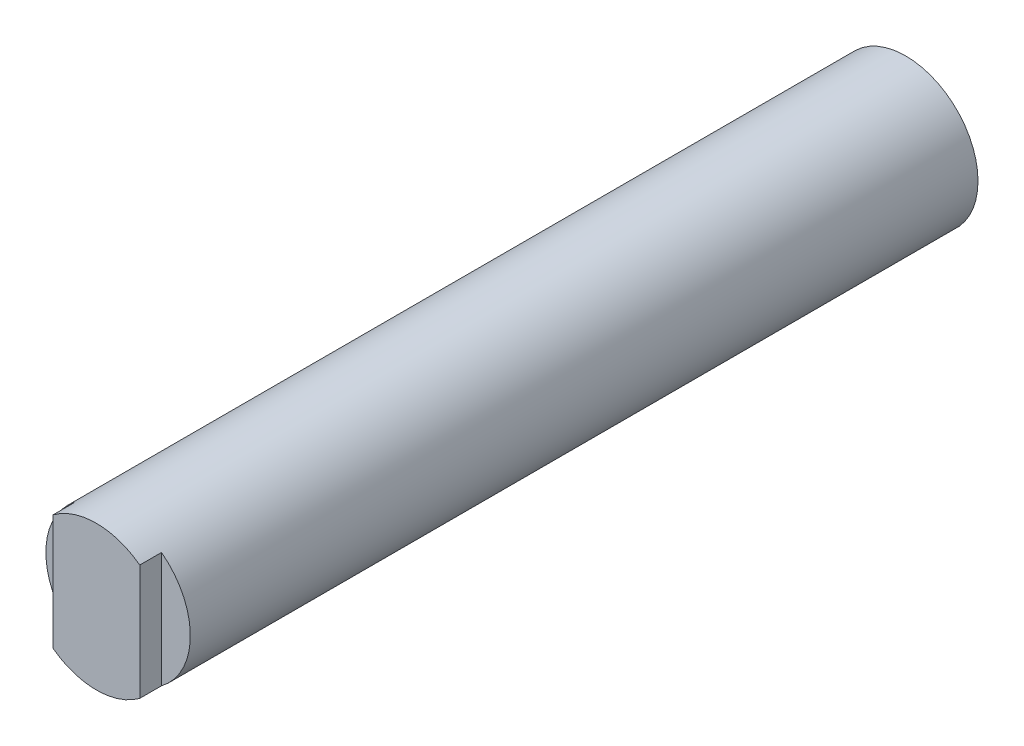
ISO-10303-21;
HEADER;
FILE_DESCRIPTION(('STEP AP214'),'2;1');
FILE_NAME('part.step','',(''),(''),'','','');
FILE_SCHEMA(('AUTOMOTIVE_DESIGN { 1 0 10303 214 1 1 1 1 }'));
ENDSEC;
DATA;
#1=APPLICATION_CONTEXT('core data for automotive mechanical design processes');
#2=APPLICATION_PROTOCOL_DEFINITION('international standard','automotive_design',2000,#1);
#3=PRODUCT_CONTEXT('',#1,'mechanical');
#4=PRODUCT('Part','Part','',(#3));
#5=PRODUCT_RELATED_PRODUCT_CATEGORY('part','',(#4));
#6=PRODUCT_DEFINITION_FORMATION('','',#4);
#7=PRODUCT_DEFINITION_CONTEXT('part definition',#1,'design');
#8=PRODUCT_DEFINITION('design','',#6,#7);
#9=PRODUCT_DEFINITION_SHAPE('','',#8);
#10=(LENGTH_UNIT() NAMED_UNIT(*) SI_UNIT(.MILLI.,.METRE.));
#11=(NAMED_UNIT(*) PLANE_ANGLE_UNIT() SI_UNIT($,.RADIAN.));
#12=(NAMED_UNIT(*) SI_UNIT($,.STERADIAN.) SOLID_ANGLE_UNIT());
#13=UNCERTAINTY_MEASURE_WITH_UNIT(LENGTH_MEASURE(1.E-05),#10,'distance_accuracy_value','');
#14=(GEOMETRIC_REPRESENTATION_CONTEXT(3) GLOBAL_UNCERTAINTY_ASSIGNED_CONTEXT((#13)) GLOBAL_UNIT_ASSIGNED_CONTEXT((#10,
#11,#12)) REPRESENTATION_CONTEXT('',''));
#15=CARTESIAN_POINT('',(0.,0.,0.));
#16=DIRECTION('',(0.,0.,1.));
#17=DIRECTION('',(1.,0.,0.));
#18=AXIS2_PLACEMENT_3D('',#15,#16,#17);
#19=CARTESIAN_POINT('',(0.,0.,295.275));
#20=DIRECTION('',(0.,0.,-1.));
#21=DIRECTION('',(-1.,0.,0.));
#22=AXIS2_PLACEMENT_3D('',#19,#20,#21);
#23=CYLINDRICAL_SURFACE('',#22,26.3525);
#24=CARTESIAN_POINT('',(0.,0.,295.275));
#25=DIRECTION('',(0.,0.,1.));
#26=DIRECTION('',(1.,0.,0.));
#27=AXIS2_PLACEMENT_3D('',#24,#25,#26);
#28=CIRCLE('',#27,26.3525);
#29=CARTESIAN_POINT('',(15.8369,21.0629260702306,295.275));
#30=VERTEX_POINT('',#29);
#31=CARTESIAN_POINT('',(-15.8369,21.0629260702306,295.275));
#32=VERTEX_POINT('',#31);
#33=EDGE_CURVE('E40',#30,#32,#28,.T.);
#34=ORIENTED_EDGE('',*,*,#33,.F.);
#35=DIRECTION('',(0.,0.,1.));
#36=VECTOR('',#35,1.);
#37=CARTESIAN_POINT('',(15.8369,21.0629260702306,287.3375));
#38=LINE('',#37,#36);
#39=CARTESIAN_POINT('',(15.8369,21.0629260702306,287.3375));
#40=VERTEX_POINT('',#39);
#41=EDGE_CURVE('E47',#40,#30,#38,.T.);
#42=ORIENTED_EDGE('',*,*,#41,.F.);
#43=CARTESIAN_POINT('',(0.,0.,287.3375));
#44=DIRECTION('',(0.,0.,1.));
#45=DIRECTION('',(1.,0.,0.));
#46=AXIS2_PLACEMENT_3D('',#43,#44,#45);
#47=CIRCLE('',#46,26.3525);
#48=CARTESIAN_POINT('',(15.8369,-21.0629260702306,287.3375));
#49=VERTEX_POINT('',#48);
#50=EDGE_CURVE('E76',#49,#40,#47,.T.);
#51=ORIENTED_EDGE('',*,*,#50,.F.);
#52=DIRECTION('',(0.,0.,1.));
#53=VECTOR('',#52,1.);
#54=CARTESIAN_POINT('',(15.8369,-21.0629260702306,287.3375));
#55=LINE('',#54,#53);
#56=CARTESIAN_POINT('',(15.8369,-21.0629260702306,295.275));
#57=VERTEX_POINT('',#56);
#58=EDGE_CURVE('E84',#49,#57,#55,.T.);
#59=ORIENTED_EDGE('',*,*,#58,.T.);
#60=CARTESIAN_POINT('',(-15.8369,-21.0629260702306,295.275));
#61=VERTEX_POINT('',#60);
#62=EDGE_CURVE('E11',#61,#57,#28,.T.);
#63=ORIENTED_EDGE('',*,*,#62,.F.);
#64=DIRECTION('',(0.,0.,1.));
#65=VECTOR('',#64,1.);
#66=CARTESIAN_POINT('',(-15.8369,-21.0629260702306,287.3375));
#67=LINE('',#66,#65);
#68=CARTESIAN_POINT('',(-15.8369,-21.0629260702306,287.3375));
#69=VERTEX_POINT('',#68);
#70=EDGE_CURVE('E55',#69,#61,#67,.T.);
#71=ORIENTED_EDGE('',*,*,#70,.F.);
#72=CARTESIAN_POINT('',(0.,0.,287.3375));
#73=DIRECTION('',(0.,0.,1.));
#74=DIRECTION('',(1.,0.,0.));
#75=AXIS2_PLACEMENT_3D('',#72,#73,#74);
#76=CIRCLE('',#75,26.3525);
#77=CARTESIAN_POINT('',(-15.8369,21.0629260702306,287.3375));
#78=VERTEX_POINT('',#77);
#79=EDGE_CURVE('E94',#78,#69,#76,.T.);
#80=ORIENTED_EDGE('',*,*,#79,.F.);
#81=DIRECTION('',(0.,0.,1.));
#82=VECTOR('',#81,1.);
#83=CARTESIAN_POINT('',(-15.8369,21.0629260702306,287.3375));
#84=LINE('',#83,#82);
#85=EDGE_CURVE('E100',#78,#32,#84,.T.);
#86=ORIENTED_EDGE('',*,*,#85,.T.);
#87=EDGE_LOOP('',(#34,#42,#51,#59,#63,#71,#80,#86));
#88=FACE_BOUND('',#87,.T.);
#89=CARTESIAN_POINT('',(0.,0.,0.));
#90=DIRECTION('',(0.,0.,1.));
#91=DIRECTION('',(1.,0.,0.));
#92=AXIS2_PLACEMENT_3D('',#89,#90,#91);
#93=CIRCLE('',#92,26.3525);
#94=CARTESIAN_POINT('',(26.3525,0.,0.));
#95=VERTEX_POINT('',#94);
#96=EDGE_CURVE('E35',#95,#95,#93,.T.);
#97=ORIENTED_EDGE('',*,*,#96,.T.);
#98=EDGE_LOOP('',(#97));
#99=FACE_BOUND('',#98,.T.);
#100=ADVANCED_FACE('F32',(#88,#99),#23,.T.);
#101=CARTESIAN_POINT('',(0.,0.,295.275));
#102=DIRECTION('',(0.,0.,1.));
#103=DIRECTION('',(1.,0.,0.));
#104=AXIS2_PLACEMENT_3D('',#101,#102,#103);
#105=PLANE('',#104);
#106=DIRECTION('',(0.,-1.,0.));
#107=VECTOR('',#106,1.);
#108=CARTESIAN_POINT('',(15.8369,-21.0629260702306,295.275));
#109=LINE('',#108,#107);
#110=EDGE_CURVE('E81',#30,#57,#109,.T.);
#111=ORIENTED_EDGE('',*,*,#110,.F.);
#112=ORIENTED_EDGE('',*,*,#33,.T.);
#113=DIRECTION('',(0.,1.,0.));
#114=VECTOR('',#113,1.);
#115=CARTESIAN_POINT('',(-15.8369,21.0629260702306,295.275));
#116=LINE('',#115,#114);
#117=EDGE_CURVE('E90',#61,#32,#116,.T.);
#118=ORIENTED_EDGE('',*,*,#117,.F.);
#119=ORIENTED_EDGE('',*,*,#62,.T.);
#120=EDGE_LOOP('',(#111,#112,#118,#119));
#121=FACE_BOUND('',#120,.T.);
#122=ADVANCED_FACE('F106',(#121),#105,.T.);
#123=CARTESIAN_POINT('',(0.,0.,0.));
#124=DIRECTION('',(0.,0.,1.));
#125=DIRECTION('',(1.,0.,0.));
#126=AXIS2_PLACEMENT_3D('',#123,#124,#125);
#127=PLANE('',#126);
#128=ORIENTED_EDGE('',*,*,#96,.F.);
#129=EDGE_LOOP('',(#128));
#130=FACE_BOUND('',#129,.T.);
#131=ADVANCED_FACE('F118',(#130),#127,.F.);
#132=CARTESIAN_POINT('',(-15.8369,21.0629260702306,287.3375));
#133=DIRECTION('',(1.,0.,0.));
#134=DIRECTION('',(0.,0.,-1.));
#135=AXIS2_PLACEMENT_3D('',#132,#133,#134);
#136=PLANE('',#135);
#137=ORIENTED_EDGE('',*,*,#117,.T.);
#138=ORIENTED_EDGE('',*,*,#85,.F.);
#139=DIRECTION('',(0.,1.,0.));
#140=VECTOR('',#139,1.);
#141=CARTESIAN_POINT('',(-15.8369,21.0629260702306,287.3375));
#142=LINE('',#141,#140);
#143=EDGE_CURVE('E96',#69,#78,#142,.T.);
#144=ORIENTED_EDGE('',*,*,#143,.F.);
#145=ORIENTED_EDGE('',*,*,#70,.T.);
#146=EDGE_LOOP('',(#137,#138,#144,#145));
#147=FACE_BOUND('',#146,.T.);
#148=ADVANCED_FACE('F108',(#147),#136,.F.);
#149=CARTESIAN_POINT('',(0.,0.,287.3375));
#150=DIRECTION('',(0.,0.,1.));
#151=DIRECTION('',(1.,0.,0.));
#152=AXIS2_PLACEMENT_3D('',#149,#150,#151);
#153=PLANE('',#152);
#154=ORIENTED_EDGE('',*,*,#79,.T.);
#155=ORIENTED_EDGE('',*,*,#143,.T.);
#156=EDGE_LOOP('',(#154,#155));
#157=FACE_BOUND('',#156,.T.);
#158=ADVANCED_FACE('F110',(#157),#153,.T.);
#159=CARTESIAN_POINT('',(15.8369,-21.0629260702306,287.3375));
#160=DIRECTION('',(-1.,0.,0.));
#161=DIRECTION('',(0.,0.,1.));
#162=AXIS2_PLACEMENT_3D('',#159,#160,#161);
#163=PLANE('',#162);
#164=ORIENTED_EDGE('',*,*,#110,.T.);
#165=ORIENTED_EDGE('',*,*,#58,.F.);
#166=DIRECTION('',(0.,-1.,0.));
#167=VECTOR('',#166,1.);
#168=CARTESIAN_POINT('',(15.8369,-21.0629260702306,287.3375));
#169=LINE('',#168,#167);
#170=EDGE_CURVE('E78',#40,#49,#169,.T.);
#171=ORIENTED_EDGE('',*,*,#170,.F.);
#172=ORIENTED_EDGE('',*,*,#41,.T.);
#173=EDGE_LOOP('',(#164,#165,#171,#172));
#174=FACE_BOUND('',#173,.T.);
#175=ADVANCED_FACE('F83',(#174),#163,.F.);
#176=CARTESIAN_POINT('',(0.,0.,287.3375));
#177=DIRECTION('',(0.,0.,1.));
#178=DIRECTION('',(1.,0.,0.));
#179=AXIS2_PLACEMENT_3D('',#176,#177,#178);
#180=PLANE('',#179);
#181=ORIENTED_EDGE('',*,*,#50,.T.);
#182=ORIENTED_EDGE('',*,*,#170,.T.);
#183=EDGE_LOOP('',(#181,#182));
#184=FACE_BOUND('',#183,.T.);
#185=ADVANCED_FACE('F77',(#184),#180,.T.);
#186=CLOSED_SHELL('',(#100,#122,#131,#148,#158,#175,#185));
#187=MANIFOLD_SOLID_BREP('B2',#186);
#188=ADVANCED_BREP_SHAPE_REPRESENTATION('',(#18,#187),#14);
#189=SHAPE_DEFINITION_REPRESENTATION(#9,#188);
ENDSEC;
END-ISO-10303-21;
